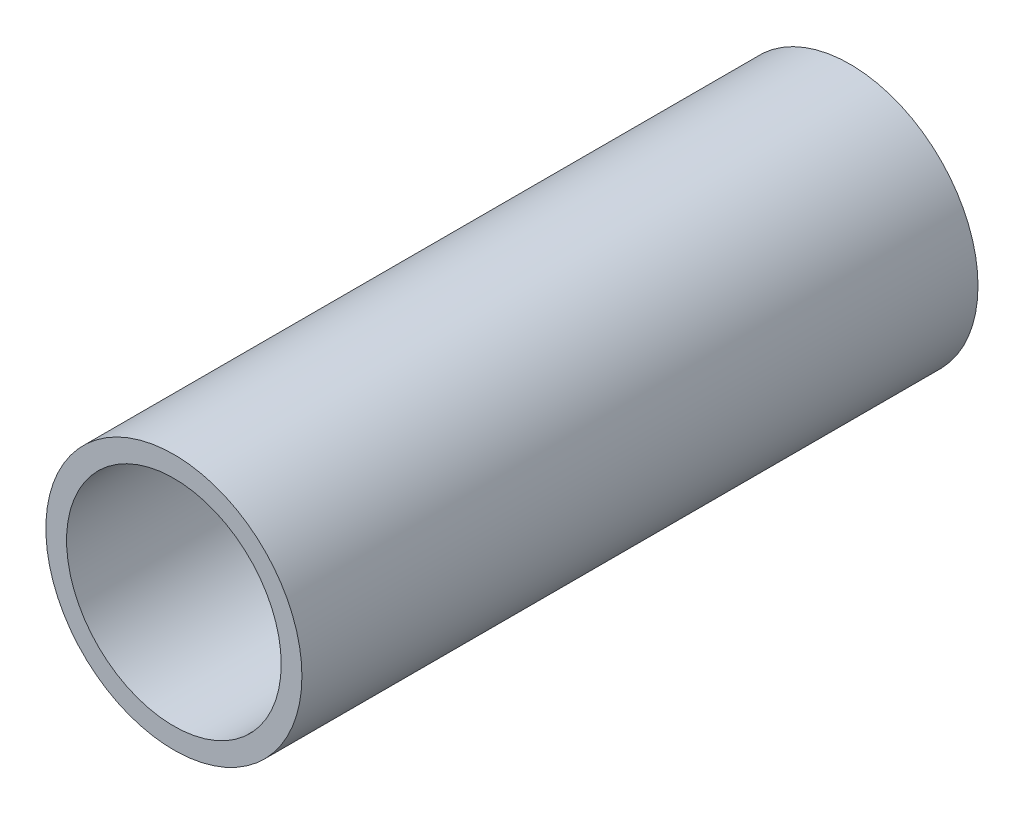
ISO-10303-21;
HEADER;
FILE_DESCRIPTION(('STEP AP214'),'2;1');
FILE_NAME('part.step','',(''),(''),'','','');
FILE_SCHEMA(('AUTOMOTIVE_DESIGN { 1 0 10303 214 1 1 1 1 }'));
ENDSEC;
DATA;
#1=APPLICATION_CONTEXT('core data for automotive mechanical design processes');
#2=APPLICATION_PROTOCOL_DEFINITION('international standard','automotive_design',2000,#1);
#3=PRODUCT_CONTEXT('',#1,'mechanical');
#4=PRODUCT('Part','Part','',(#3));
#5=PRODUCT_RELATED_PRODUCT_CATEGORY('part','',(#4));
#6=PRODUCT_DEFINITION_FORMATION('','',#4);
#7=PRODUCT_DEFINITION_CONTEXT('part definition',#1,'design');
#8=PRODUCT_DEFINITION('design','',#6,#7);
#9=PRODUCT_DEFINITION_SHAPE('','',#8);
#10=(LENGTH_UNIT() NAMED_UNIT(*) SI_UNIT(.MILLI.,.METRE.));
#11=(NAMED_UNIT(*) PLANE_ANGLE_UNIT() SI_UNIT($,.RADIAN.));
#12=(NAMED_UNIT(*) SI_UNIT($,.STERADIAN.) SOLID_ANGLE_UNIT());
#13=UNCERTAINTY_MEASURE_WITH_UNIT(LENGTH_MEASURE(1.E-05),#10,'distance_accuracy_value','');
#14=(GEOMETRIC_REPRESENTATION_CONTEXT(3) GLOBAL_UNCERTAINTY_ASSIGNED_CONTEXT((#13)) GLOBAL_UNIT_ASSIGNED_CONTEXT((#10,
#11,#12)) REPRESENTATION_CONTEXT('',''));
#15=CARTESIAN_POINT('',(0.,0.,0.));
#16=DIRECTION('',(0.,0.,1.));
#17=DIRECTION('',(1.,0.,0.));
#18=AXIS2_PLACEMENT_3D('',#15,#16,#17);
#19=CARTESIAN_POINT('',(0.,0.,160.));
#20=DIRECTION('',(0.,0.,1.));
#21=DIRECTION('',(1.,0.,0.));
#22=AXIS2_PLACEMENT_3D('',#19,#20,#21);
#23=PLANE('',#22);
#24=CARTESIAN_POINT('',(0.,0.,160.));
#25=DIRECTION('',(0.,0.,1.));
#26=DIRECTION('',(1.,0.,0.));
#27=AXIS2_PLACEMENT_3D('',#24,#25,#26);
#28=CIRCLE('',#27,30.3);
#29=CARTESIAN_POINT('',(30.3,0.,160.));
#30=VERTEX_POINT('',#29);
#31=EDGE_CURVE('E10',#30,#30,#28,.T.);
#32=ORIENTED_EDGE('',*,*,#31,.T.);
#33=EDGE_LOOP('',(#32));
#34=FACE_BOUND('',#33,.T.);
#35=CARTESIAN_POINT('',(0.,0.,160.));
#36=DIRECTION('',(0.,0.,1.));
#37=DIRECTION('',(1.,0.,0.));
#38=AXIS2_PLACEMENT_3D('',#35,#36,#37);
#39=CIRCLE('',#38,25.4);
#40=CARTESIAN_POINT('',(25.4,0.,160.));
#41=VERTEX_POINT('',#40);
#42=EDGE_CURVE('E54',#41,#41,#39,.T.);
#43=ORIENTED_EDGE('',*,*,#42,.F.);
#44=EDGE_LOOP('',(#43));
#45=FACE_BOUND('',#44,.T.);
#46=ADVANCED_FACE('F41',(#34,#45),#23,.T.);
#47=CARTESIAN_POINT('',(0.,0.,0.));
#48=DIRECTION('',(0.,0.,1.));
#49=DIRECTION('',(1.,0.,0.));
#50=AXIS2_PLACEMENT_3D('',#47,#48,#49);
#51=PLANE('',#50);
#52=CARTESIAN_POINT('',(0.,0.,0.));
#53=DIRECTION('',(0.,0.,1.));
#54=DIRECTION('',(1.,0.,0.));
#55=AXIS2_PLACEMENT_3D('',#52,#53,#54);
#56=CIRCLE('',#55,30.3);
#57=CARTESIAN_POINT('',(30.3,0.,0.));
#58=VERTEX_POINT('',#57);
#59=EDGE_CURVE('E45',#58,#58,#56,.T.);
#60=ORIENTED_EDGE('',*,*,#59,.F.);
#61=EDGE_LOOP('',(#60));
#62=FACE_BOUND('',#61,.T.);
#63=CARTESIAN_POINT('',(0.,0.,0.));
#64=DIRECTION('',(0.,0.,1.));
#65=DIRECTION('',(1.,0.,0.));
#66=AXIS2_PLACEMENT_3D('',#63,#64,#65);
#67=CIRCLE('',#66,25.4);
#68=CARTESIAN_POINT('',(25.4,0.,0.));
#69=VERTEX_POINT('',#68);
#70=EDGE_CURVE('E56',#69,#69,#67,.T.);
#71=ORIENTED_EDGE('',*,*,#70,.T.);
#72=EDGE_LOOP('',(#71));
#73=FACE_BOUND('',#72,.T.);
#74=ADVANCED_FACE('F68',(#62,#73),#51,.F.);
#75=CARTESIAN_POINT('',(0.,0.,160.));
#76=DIRECTION('',(0.,0.,-1.));
#77=DIRECTION('',(-1.,0.,0.));
#78=AXIS2_PLACEMENT_3D('',#75,#76,#77);
#79=CYLINDRICAL_SURFACE('',#78,30.3);
#80=ORIENTED_EDGE('',*,*,#31,.F.);
#81=EDGE_LOOP('',(#80));
#82=FACE_BOUND('',#81,.T.);
#83=ORIENTED_EDGE('',*,*,#59,.T.);
#84=EDGE_LOOP('',(#83));
#85=FACE_BOUND('',#84,.T.);
#86=ADVANCED_FACE('F43',(#82,#85),#79,.T.);
#87=CARTESIAN_POINT('',(0.,0.,160.));
#88=DIRECTION('',(0.,0.,-1.));
#89=DIRECTION('',(-1.,0.,0.));
#90=AXIS2_PLACEMENT_3D('',#87,#88,#89);
#91=CYLINDRICAL_SURFACE('',#90,25.4);
#92=ORIENTED_EDGE('',*,*,#42,.T.);
#93=EDGE_LOOP('',(#92));
#94=FACE_BOUND('',#93,.T.);
#95=ORIENTED_EDGE('',*,*,#70,.F.);
#96=EDGE_LOOP('',(#95));
#97=FACE_BOUND('',#96,.T.);
#98=ADVANCED_FACE('F64',(#94,#97),#91,.F.);
#99=CLOSED_SHELL('',(#46,#74,#86,#98));
#100=MANIFOLD_SOLID_BREP('B2',#99);
#101=ADVANCED_BREP_SHAPE_REPRESENTATION('',(#18,#100),#14);
#102=SHAPE_DEFINITION_REPRESENTATION(#9,#101);
ENDSEC;
END-ISO-10303-21;
